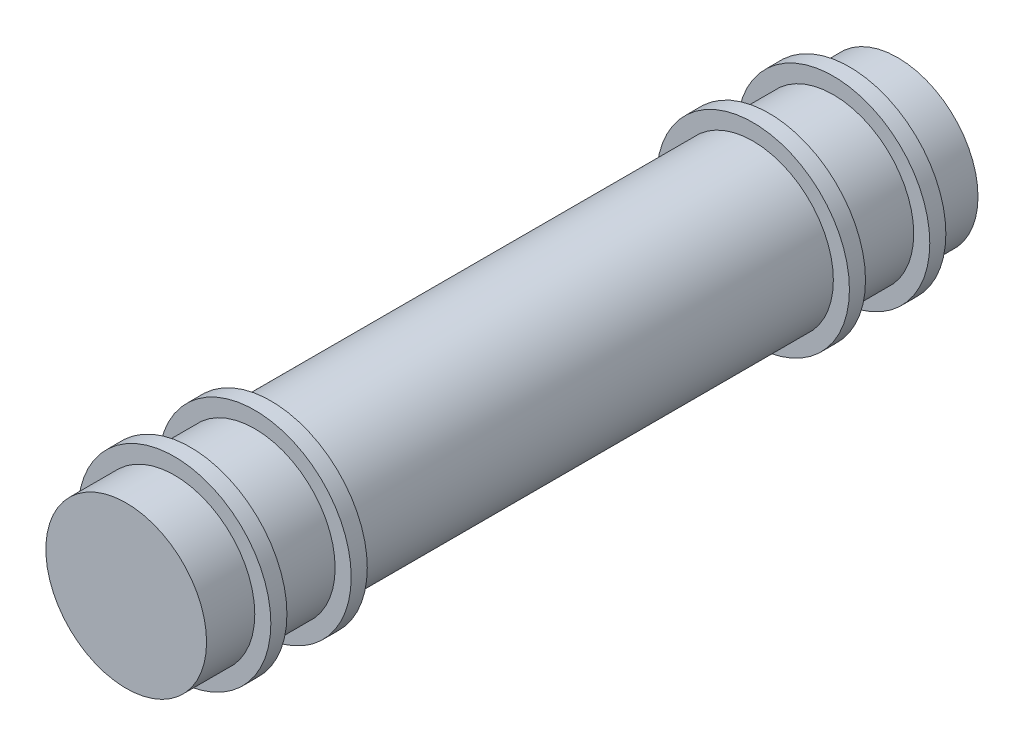
ISO-10303-21;
HEADER;
FILE_DESCRIPTION(('STEP AP214'),'2;1');
FILE_NAME('part.step','',(''),(''),'','','');
FILE_SCHEMA(('AUTOMOTIVE_DESIGN { 1 0 10303 214 1 1 1 1 }'));
ENDSEC;
DATA;
#1=APPLICATION_CONTEXT('core data for automotive mechanical design processes');
#2=APPLICATION_PROTOCOL_DEFINITION('international standard','automotive_design',2000,#1);
#3=PRODUCT_CONTEXT('',#1,'mechanical');
#4=PRODUCT('Part','Part','',(#3));
#5=PRODUCT_RELATED_PRODUCT_CATEGORY('part','',(#4));
#6=PRODUCT_DEFINITION_FORMATION('','',#4);
#7=PRODUCT_DEFINITION_CONTEXT('part definition',#1,'design');
#8=PRODUCT_DEFINITION('design','',#6,#7);
#9=PRODUCT_DEFINITION_SHAPE('','',#8);
#10=(LENGTH_UNIT() NAMED_UNIT(*) SI_UNIT(.MILLI.,.METRE.));
#11=(NAMED_UNIT(*) PLANE_ANGLE_UNIT() SI_UNIT($,.RADIAN.));
#12=(NAMED_UNIT(*) SI_UNIT($,.STERADIAN.) SOLID_ANGLE_UNIT());
#13=UNCERTAINTY_MEASURE_WITH_UNIT(LENGTH_MEASURE(1.E-05),#10,'distance_accuracy_value','');
#14=(GEOMETRIC_REPRESENTATION_CONTEXT(3) GLOBAL_UNCERTAINTY_ASSIGNED_CONTEXT((#13)) GLOBAL_UNIT_ASSIGNED_CONTEXT((#10,
#11,#12)) REPRESENTATION_CONTEXT('',''));
#15=CARTESIAN_POINT('',(0.,0.,0.));
#16=DIRECTION('',(0.,0.,1.));
#17=DIRECTION('',(1.,0.,0.));
#18=AXIS2_PLACEMENT_3D('',#15,#16,#17);
#19=CARTESIAN_POINT('',(0.,0.,24.));
#20=DIRECTION('',(0.,0.,-1.));
#21=DIRECTION('',(-1.,0.,0.));
#22=AXIS2_PLACEMENT_3D('',#19,#20,#21);
#23=CYLINDRICAL_SURFACE('',#22,2.5);
#24=CARTESIAN_POINT('',(0.,0.,19.5));
#25=DIRECTION('',(0.,0.,-1.));
#26=DIRECTION('',(-1.,0.,0.));
#27=AXIS2_PLACEMENT_3D('',#24,#25,#26);
#28=CIRCLE('',#27,2.5);
#29=CARTESIAN_POINT('',(-2.5,0.,19.5));
#30=VERTEX_POINT('',#29);
#31=EDGE_CURVE('E66',#30,#30,#28,.T.);
#32=ORIENTED_EDGE('',*,*,#31,.T.);
#33=EDGE_LOOP('',(#32));
#34=FACE_BOUND('',#33,.T.);
#35=CARTESIAN_POINT('',(0.,0.,4.5));
#36=DIRECTION('',(0.,0.,1.));
#37=DIRECTION('',(1.,0.,0.));
#38=AXIS2_PLACEMENT_3D('',#35,#36,#37);
#39=CIRCLE('',#38,2.5);
#40=CARTESIAN_POINT('',(2.5,0.,4.5));
#41=VERTEX_POINT('',#40);
#42=EDGE_CURVE('E55',#41,#41,#39,.T.);
#43=ORIENTED_EDGE('',*,*,#42,.T.);
#44=EDGE_LOOP('',(#43));
#45=FACE_BOUND('',#44,.T.);
#46=ADVANCED_FACE('F31',(#34,#45),#23,.T.);
#47=CARTESIAN_POINT('',(0.,0.,4.));
#48=DIRECTION('',(0.,0.,-1.));
#49=DIRECTION('',(-1.,0.,0.));
#50=AXIS2_PLACEMENT_3D('',#47,#48,#49);
#51=CIRCLE('',#50,2.5);
#52=CARTESIAN_POINT('',(-2.5,0.,4.));
#53=VERTEX_POINT('',#52);
#54=EDGE_CURVE('E58',#53,#53,#51,.T.);
#55=ORIENTED_EDGE('',*,*,#54,.T.);
#56=EDGE_LOOP('',(#55));
#57=FACE_BOUND('',#56,.T.);
#58=CARTESIAN_POINT('',(0.,0.,2.));
#59=DIRECTION('',(0.,0.,1.));
#60=DIRECTION('',(1.,0.,0.));
#61=AXIS2_PLACEMENT_3D('',#58,#59,#60);
#62=CIRCLE('',#61,2.5);
#63=CARTESIAN_POINT('',(2.5,0.,2.));
#64=VERTEX_POINT('',#63);
#65=EDGE_CURVE('E50',#64,#64,#62,.T.);
#66=ORIENTED_EDGE('',*,*,#65,.T.);
#67=EDGE_LOOP('',(#66));
#68=FACE_BOUND('',#67,.T.);
#69=ADVANCED_FACE('F118',(#57,#68),#23,.T.);
#70=CARTESIAN_POINT('',(0.,0.,1.5));
#71=DIRECTION('',(0.,0.,-1.));
#72=DIRECTION('',(-1.,0.,0.));
#73=AXIS2_PLACEMENT_3D('',#70,#71,#72);
#74=CIRCLE('',#73,2.5);
#75=CARTESIAN_POINT('',(-2.5,0.,1.5));
#76=VERTEX_POINT('',#75);
#77=EDGE_CURVE('E44',#76,#76,#74,.T.);
#78=ORIENTED_EDGE('',*,*,#77,.T.);
#79=EDGE_LOOP('',(#78));
#80=FACE_BOUND('',#79,.T.);
#81=CARTESIAN_POINT('',(0.,0.,0.));
#82=DIRECTION('',(0.,0.,1.));
#83=DIRECTION('',(1.,0.,0.));
#84=AXIS2_PLACEMENT_3D('',#81,#82,#83);
#85=CIRCLE('',#84,2.5);
#86=CARTESIAN_POINT('',(2.5,0.,0.));
#87=VERTEX_POINT('',#86);
#88=EDGE_CURVE('E39',#87,#87,#85,.T.);
#89=ORIENTED_EDGE('',*,*,#88,.T.);
#90=EDGE_LOOP('',(#89));
#91=FACE_BOUND('',#90,.T.);
#92=ADVANCED_FACE('F113',(#80,#91),#23,.T.);
#93=CARTESIAN_POINT('',(0.,0.,0.));
#94=DIRECTION('',(0.,0.,1.));
#95=DIRECTION('',(1.,0.,0.));
#96=AXIS2_PLACEMENT_3D('',#93,#94,#95);
#97=PLANE('',#96);
#98=ORIENTED_EDGE('',*,*,#88,.F.);
#99=EDGE_LOOP('',(#98));
#100=FACE_BOUND('',#99,.T.);
#101=ADVANCED_FACE('F103',(#100),#97,.F.);
#102=CARTESIAN_POINT('',(0.,0.,1.5));
#103=DIRECTION('',(0.,0.,-1.));
#104=DIRECTION('',(-1.,0.,0.));
#105=AXIS2_PLACEMENT_3D('',#102,#103,#104);
#106=PLANE('',#105);
#107=ORIENTED_EDGE('',*,*,#77,.F.);
#108=EDGE_LOOP('',(#107));
#109=FACE_BOUND('',#108,.T.);
#110=CARTESIAN_POINT('',(0.,0.,1.5));
#111=DIRECTION('',(0.,0.,1.));
#112=DIRECTION('',(1.,0.,0.));
#113=AXIS2_PLACEMENT_3D('',#110,#111,#112);
#114=CIRCLE('',#113,3.);
#115=CARTESIAN_POINT('',(3.,0.,1.5));
#116=VERTEX_POINT('',#115);
#117=EDGE_CURVE('E47',#116,#116,#114,.T.);
#118=ORIENTED_EDGE('',*,*,#117,.F.);
#119=EDGE_LOOP('',(#118));
#120=FACE_BOUND('',#119,.T.);
#121=ADVANCED_FACE('F101',(#109,#120),#106,.T.);
#122=CARTESIAN_POINT('',(0.,0.,2.));
#123=DIRECTION('',(0.,0.,1.));
#124=DIRECTION('',(1.,0.,0.));
#125=AXIS2_PLACEMENT_3D('',#122,#123,#124);
#126=CYLINDRICAL_SURFACE('',#125,3.);
#127=ORIENTED_EDGE('',*,*,#117,.T.);
#128=EDGE_LOOP('',(#127));
#129=FACE_BOUND('',#128,.T.);
#130=CARTESIAN_POINT('',(0.,0.,2.));
#131=DIRECTION('',(0.,0.,1.));
#132=DIRECTION('',(1.,0.,0.));
#133=AXIS2_PLACEMENT_3D('',#130,#131,#132);
#134=CIRCLE('',#133,3.);
#135=CARTESIAN_POINT('',(3.,0.,2.));
#136=VERTEX_POINT('',#135);
#137=EDGE_CURVE('E62',#136,#136,#134,.T.);
#138=ORIENTED_EDGE('',*,*,#137,.F.);
#139=EDGE_LOOP('',(#138));
#140=FACE_BOUND('',#139,.T.);
#141=ADVANCED_FACE('F98',(#129,#140),#126,.T.);
#142=CARTESIAN_POINT('',(0.,-3.,2.));
#143=DIRECTION('',(0.,0.,1.));
#144=DIRECTION('',(1.,0.,0.));
#145=AXIS2_PLACEMENT_3D('',#142,#143,#144);
#146=PLANE('',#145);
#147=ORIENTED_EDGE('',*,*,#65,.F.);
#148=EDGE_LOOP('',(#147));
#149=FACE_BOUND('',#148,.T.);
#150=ORIENTED_EDGE('',*,*,#137,.T.);
#151=EDGE_LOOP('',(#150));
#152=FACE_BOUND('',#151,.T.);
#153=ADVANCED_FACE('F110',(#149,#152),#146,.T.);
#154=CARTESIAN_POINT('',(0.,0.,4.));
#155=DIRECTION('',(0.,0.,-1.));
#156=DIRECTION('',(-1.,0.,0.));
#157=AXIS2_PLACEMENT_3D('',#154,#155,#156);
#158=PLANE('',#157);
#159=ORIENTED_EDGE('',*,*,#54,.F.);
#160=EDGE_LOOP('',(#159));
#161=FACE_BOUND('',#160,.T.);
#162=CARTESIAN_POINT('',(0.,0.,4.));
#163=DIRECTION('',(0.,0.,1.));
#164=DIRECTION('',(1.,0.,0.));
#165=AXIS2_PLACEMENT_3D('',#162,#163,#164);
#166=CIRCLE('',#165,3.);
#167=CARTESIAN_POINT('',(3.,0.,4.));
#168=VERTEX_POINT('',#167);
#169=EDGE_CURVE('E59',#168,#168,#166,.T.);
#170=ORIENTED_EDGE('',*,*,#169,.F.);
#171=EDGE_LOOP('',(#170));
#172=FACE_BOUND('',#171,.T.);
#173=ADVANCED_FACE('F181',(#161,#172),#158,.T.);
#174=CARTESIAN_POINT('',(0.,0.,2.));
#175=DIRECTION('',(0.,0.,1.));
#176=DIRECTION('',(1.,0.,0.));
#177=AXIS2_PLACEMENT_3D('',#174,#175,#176);
#178=CYLINDRICAL_SURFACE('',#177,3.);
#179=ORIENTED_EDGE('',*,*,#169,.T.);
#180=EDGE_LOOP('',(#179));
#181=FACE_BOUND('',#180,.T.);
#182=CARTESIAN_POINT('',(0.,0.,4.5));
#183=DIRECTION('',(0.,0.,1.));
#184=DIRECTION('',(1.,0.,0.));
#185=AXIS2_PLACEMENT_3D('',#182,#183,#184);
#186=CIRCLE('',#185,3.);
#187=CARTESIAN_POINT('',(3.,0.,4.5));
#188=VERTEX_POINT('',#187);
#189=EDGE_CURVE('E69',#188,#188,#186,.T.);
#190=ORIENTED_EDGE('',*,*,#189,.F.);
#191=EDGE_LOOP('',(#190));
#192=FACE_BOUND('',#191,.T.);
#193=ADVANCED_FACE('F191',(#181,#192),#178,.T.);
#194=CARTESIAN_POINT('',(0.,-3.,4.5));
#195=DIRECTION('',(0.,0.,1.));
#196=DIRECTION('',(1.,0.,0.));
#197=AXIS2_PLACEMENT_3D('',#194,#195,#196);
#198=PLANE('',#197);
#199=ORIENTED_EDGE('',*,*,#42,.F.);
#200=EDGE_LOOP('',(#199));
#201=FACE_BOUND('',#200,.T.);
#202=ORIENTED_EDGE('',*,*,#189,.T.);
#203=EDGE_LOOP('',(#202));
#204=FACE_BOUND('',#203,.T.);
#205=ADVANCED_FACE('F200',(#201,#204),#198,.T.);
#206=CARTESIAN_POINT('',(0.,0.,19.5));
#207=DIRECTION('',(0.,0.,-1.));
#208=DIRECTION('',(-1.,0.,0.));
#209=AXIS2_PLACEMENT_3D('',#206,#207,#208);
#210=PLANE('',#209);
#211=ORIENTED_EDGE('',*,*,#31,.F.);
#212=EDGE_LOOP('',(#211));
#213=FACE_BOUND('',#212,.T.);
#214=CARTESIAN_POINT('',(0.,0.,19.5));
#215=DIRECTION('',(0.,0.,1.));
#216=DIRECTION('',(1.,0.,0.));
#217=AXIS2_PLACEMENT_3D('',#214,#215,#216);
#218=CIRCLE('',#217,3.);
#219=CARTESIAN_POINT('',(3.,0.,19.5));
#220=VERTEX_POINT('',#219);
#221=EDGE_CURVE('E67',#220,#220,#218,.T.);
#222=ORIENTED_EDGE('',*,*,#221,.F.);
#223=EDGE_LOOP('',(#222));
#224=FACE_BOUND('',#223,.T.);
#225=ADVANCED_FACE('F209',(#213,#224),#210,.T.);
#226=CARTESIAN_POINT('',(0.,0.,20.));
#227=DIRECTION('',(0.,0.,1.));
#228=DIRECTION('',(1.,0.,0.));
#229=AXIS2_PLACEMENT_3D('',#226,#227,#228);
#230=CYLINDRICAL_SURFACE('',#229,3.);
#231=ORIENTED_EDGE('',*,*,#221,.T.);
#232=EDGE_LOOP('',(#231));
#233=FACE_BOUND('',#232,.T.);
#234=CARTESIAN_POINT('',(0.,0.,20.));
#235=DIRECTION('',(0.,0.,1.));
#236=DIRECTION('',(1.,0.,0.));
#237=AXIS2_PLACEMENT_3D('',#234,#235,#236);
#238=CIRCLE('',#237,3.);
#239=CARTESIAN_POINT('',(3.,0.,20.));
#240=VERTEX_POINT('',#239);
#241=EDGE_CURVE('E76',#240,#240,#238,.T.);
#242=ORIENTED_EDGE('',*,*,#241,.F.);
#243=EDGE_LOOP('',(#242));
#244=FACE_BOUND('',#243,.T.);
#245=ADVANCED_FACE('F149',(#233,#244),#230,.T.);
#246=CARTESIAN_POINT('',(0.,-3.,20.));
#247=DIRECTION('',(0.,0.,1.));
#248=DIRECTION('',(1.,0.,0.));
#249=AXIS2_PLACEMENT_3D('',#246,#247,#248);
#250=PLANE('',#249);
#251=CARTESIAN_POINT('',(0.,0.,20.));
#252=DIRECTION('',(0.,0.,1.));
#253=DIRECTION('',(1.,0.,0.));
#254=AXIS2_PLACEMENT_3D('',#251,#252,#253);
#255=CIRCLE('',#254,2.5);
#256=CARTESIAN_POINT('',(2.5,0.,20.));
#257=VERTEX_POINT('',#256);
#258=EDGE_CURVE('E63',#257,#257,#255,.T.);
#259=ORIENTED_EDGE('',*,*,#258,.F.);
#260=EDGE_LOOP('',(#259));
#261=FACE_BOUND('',#260,.T.);
#262=ORIENTED_EDGE('',*,*,#241,.T.);
#263=EDGE_LOOP('',(#262));
#264=FACE_BOUND('',#263,.T.);
#265=ADVANCED_FACE('F139',(#261,#264),#250,.T.);
#266=CARTESIAN_POINT('',(0.,0.,22.));
#267=DIRECTION('',(0.,0.,-1.));
#268=DIRECTION('',(-1.,0.,0.));
#269=AXIS2_PLACEMENT_3D('',#266,#267,#268);
#270=CIRCLE('',#269,2.5);
#271=CARTESIAN_POINT('',(-2.5,0.,22.));
#272=VERTEX_POINT('',#271);
#273=EDGE_CURVE('E70',#272,#272,#270,.T.);
#274=ORIENTED_EDGE('',*,*,#273,.T.);
#275=EDGE_LOOP('',(#274));
#276=FACE_BOUND('',#275,.T.);
#277=ORIENTED_EDGE('',*,*,#258,.T.);
#278=EDGE_LOOP('',(#277));
#279=FACE_BOUND('',#278,.T.);
#280=ADVANCED_FACE('F33',(#276,#279),#23,.T.);
#281=CARTESIAN_POINT('',(0.,0.,22.5));
#282=DIRECTION('',(0.,0.,1.));
#283=DIRECTION('',(1.,0.,0.));
#284=AXIS2_PLACEMENT_3D('',#281,#282,#283);
#285=PLANE('',#284);
#286=CARTESIAN_POINT('',(0.,0.,22.5));
#287=DIRECTION('',(0.,0.,1.));
#288=DIRECTION('',(1.,0.,0.));
#289=AXIS2_PLACEMENT_3D('',#286,#287,#288);
#290=CIRCLE('',#289,2.5);
#291=CARTESIAN_POINT('',(2.5,0.,22.5));
#292=VERTEX_POINT('',#291);
#293=EDGE_CURVE('E35',#292,#292,#290,.T.);
#294=ORIENTED_EDGE('',*,*,#293,.F.);
#295=EDGE_LOOP('',(#294));
#296=FACE_BOUND('',#295,.T.);
#297=CARTESIAN_POINT('',(0.,0.,22.5));
#298=DIRECTION('',(0.,0.,1.));
#299=DIRECTION('',(1.,0.,0.));
#300=AXIS2_PLACEMENT_3D('',#297,#298,#299);
#301=CIRCLE('',#300,3.);
#302=CARTESIAN_POINT('',(3.,0.,22.5));
#303=VERTEX_POINT('',#302);
#304=EDGE_CURVE('E72',#303,#303,#301,.T.);
#305=ORIENTED_EDGE('',*,*,#304,.T.);
#306=EDGE_LOOP('',(#305));
#307=FACE_BOUND('',#306,.T.);
#308=ADVANCED_FACE('F138',(#296,#307),#285,.T.);
#309=CARTESIAN_POINT('',(0.,0.,20.));
#310=DIRECTION('',(0.,0.,1.));
#311=DIRECTION('',(1.,0.,0.));
#312=AXIS2_PLACEMENT_3D('',#309,#310,#311);
#313=CYLINDRICAL_SURFACE('',#312,3.);
#314=CARTESIAN_POINT('',(0.,0.,22.));
#315=DIRECTION('',(0.,0.,1.));
#316=DIRECTION('',(1.,0.,0.));
#317=AXIS2_PLACEMENT_3D('',#314,#315,#316);
#318=CIRCLE('',#317,3.);
#319=CARTESIAN_POINT('',(3.,0.,22.));
#320=VERTEX_POINT('',#319);
#321=EDGE_CURVE('E78',#320,#320,#318,.T.);
#322=ORIENTED_EDGE('',*,*,#321,.T.);
#323=EDGE_LOOP('',(#322));
#324=FACE_BOUND('',#323,.T.);
#325=ORIENTED_EDGE('',*,*,#304,.F.);
#326=EDGE_LOOP('',(#325));
#327=FACE_BOUND('',#326,.T.);
#328=ADVANCED_FACE('F145',(#324,#327),#313,.T.);
#329=CARTESIAN_POINT('',(0.,-3.,22.));
#330=DIRECTION('',(0.,0.,-1.));
#331=DIRECTION('',(-1.,0.,0.));
#332=AXIS2_PLACEMENT_3D('',#329,#330,#331);
#333=PLANE('',#332);
#334=ORIENTED_EDGE('',*,*,#273,.F.);
#335=EDGE_LOOP('',(#334));
#336=FACE_BOUND('',#335,.T.);
#337=ORIENTED_EDGE('',*,*,#321,.F.);
#338=EDGE_LOOP('',(#337));
#339=FACE_BOUND('',#338,.T.);
#340=ADVANCED_FACE('F135',(#336,#339),#333,.T.);
#341=CARTESIAN_POINT('',(0.,0.,24.));
#342=DIRECTION('',(0.,0.,1.));
#343=DIRECTION('',(1.,0.,0.));
#344=AXIS2_PLACEMENT_3D('',#341,#342,#343);
#345=PLANE('',#344);
#346=CARTESIAN_POINT('',(0.,0.,24.));
#347=DIRECTION('',(0.,0.,1.));
#348=DIRECTION('',(1.,0.,0.));
#349=AXIS2_PLACEMENT_3D('',#346,#347,#348);
#350=CIRCLE('',#349,2.5);
#351=CARTESIAN_POINT('',(2.5,0.,24.));
#352=VERTEX_POINT('',#351);
#353=EDGE_CURVE('E10',#352,#352,#350,.T.);
#354=ORIENTED_EDGE('',*,*,#353,.T.);
#355=EDGE_LOOP('',(#354));
#356=FACE_BOUND('',#355,.T.);
#357=ADVANCED_FACE('F129',(#356),#345,.T.);
#358=ORIENTED_EDGE('',*,*,#293,.T.);
#359=EDGE_LOOP('',(#358));
#360=FACE_BOUND('',#359,.T.);
#361=ORIENTED_EDGE('',*,*,#353,.F.);
#362=EDGE_LOOP('',(#361));
#363=FACE_BOUND('',#362,.T.);
#364=ADVANCED_FACE('F120',(#360,#363),#23,.T.);
#365=CLOSED_SHELL('',(#46,#69,#92,#101,#121,#141,#153,#173,#193,#205,#225,#245,#265,#280,#308,
#328,#340,#357,#364));
#366=MANIFOLD_SOLID_BREP('B2',#365);
#367=ADVANCED_BREP_SHAPE_REPRESENTATION('',(#18,#366),#14);
#368=SHAPE_DEFINITION_REPRESENTATION(#9,#367);
ENDSEC;
END-ISO-10303-21;
